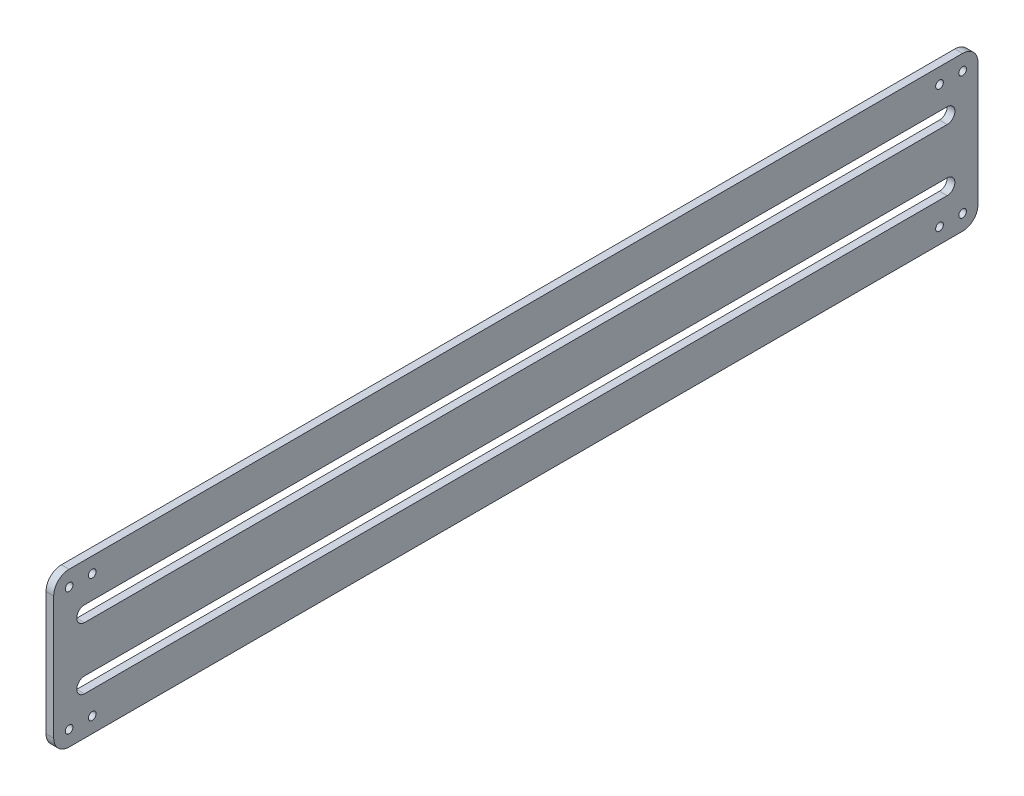
ISO-10303-21;
HEADER;
FILE_DESCRIPTION(('STEP AP214'),'2;1');
FILE_NAME('part.step','',(''),(''),'','','');
FILE_SCHEMA(('AUTOMOTIVE_DESIGN { 1 0 10303 214 1 1 1 1 }'));
ENDSEC;
DATA;
#1=APPLICATION_CONTEXT('core data for automotive mechanical design processes');
#2=APPLICATION_PROTOCOL_DEFINITION('international standard','automotive_design',2000,#1);
#3=PRODUCT_CONTEXT('',#1,'mechanical');
#4=PRODUCT('Part','Part','',(#3));
#5=PRODUCT_RELATED_PRODUCT_CATEGORY('part','',(#4));
#6=PRODUCT_DEFINITION_FORMATION('','',#4);
#7=PRODUCT_DEFINITION_CONTEXT('part definition',#1,'design');
#8=PRODUCT_DEFINITION('design','',#6,#7);
#9=PRODUCT_DEFINITION_SHAPE('','',#8);
#10=(LENGTH_UNIT() NAMED_UNIT(*) SI_UNIT(.MILLI.,.METRE.));
#11=(NAMED_UNIT(*) PLANE_ANGLE_UNIT() SI_UNIT($,.RADIAN.));
#12=(NAMED_UNIT(*) SI_UNIT($,.STERADIAN.) SOLID_ANGLE_UNIT());
#13=UNCERTAINTY_MEASURE_WITH_UNIT(LENGTH_MEASURE(1.E-05),#10,'distance_accuracy_value','');
#14=(GEOMETRIC_REPRESENTATION_CONTEXT(3) GLOBAL_UNCERTAINTY_ASSIGNED_CONTEXT((#13)) GLOBAL_UNIT_ASSIGNED_CONTEXT((#10,
#11,#12)) REPRESENTATION_CONTEXT('',''));
#15=CARTESIAN_POINT('',(0.,0.,0.));
#16=DIRECTION('',(0.,0.,1.));
#17=DIRECTION('',(1.,0.,0.));
#18=AXIS2_PLACEMENT_3D('',#15,#16,#17);
#19=CARTESIAN_POINT('',(1.5875,25.4,-184.15));
#20=DIRECTION('',(-1.,0.,0.));
#21=DIRECTION('',(0.,0.,1.));
#22=AXIS2_PLACEMENT_3D('',#19,#20,#21);
#23=CYLINDRICAL_SURFACE('',#22,6.34999999999999);
#24=CARTESIAN_POINT('',(-1.5875,25.4,-184.15));
#25=DIRECTION('',(1.,0.,0.));
#26=DIRECTION('',(0.,0.,1.));
#27=AXIS2_PLACEMENT_3D('',#24,#25,#26);
#28=CIRCLE('',#27,6.34999999999999);
#29=CARTESIAN_POINT('',(-1.5875,25.4,-190.5));
#30=VERTEX_POINT('',#29);
#31=CARTESIAN_POINT('',(-1.5875,31.75,-184.15));
#32=VERTEX_POINT('',#31);
#33=EDGE_CURVE('E207',#30,#32,#28,.T.);
#34=ORIENTED_EDGE('',*,*,#33,.T.);
#35=DIRECTION('',(-1.,0.,0.));
#36=VECTOR('',#35,1.);
#37=CARTESIAN_POINT('',(1.5875,31.75,-184.15));
#38=LINE('',#37,#36);
#39=CARTESIAN_POINT('',(1.5875,31.75,-184.15));
#40=VERTEX_POINT('',#39);
#41=EDGE_CURVE('E11',#40,#32,#38,.T.);
#42=ORIENTED_EDGE('',*,*,#41,.F.);
#43=CARTESIAN_POINT('',(1.5875,25.4,-184.15));
#44=DIRECTION('',(1.,0.,0.));
#45=DIRECTION('',(0.,0.,1.));
#46=AXIS2_PLACEMENT_3D('',#43,#44,#45);
#47=CIRCLE('',#46,6.34999999999999);
#48=CARTESIAN_POINT('',(1.5875,25.4,-190.5));
#49=VERTEX_POINT('',#48);
#50=EDGE_CURVE('E256',#49,#40,#47,.T.);
#51=ORIENTED_EDGE('',*,*,#50,.F.);
#52=DIRECTION('',(-1.,0.,0.));
#53=VECTOR('',#52,1.);
#54=CARTESIAN_POINT('',(1.5875,25.4,-190.5));
#55=LINE('',#54,#53);
#56=EDGE_CURVE('E282',#49,#30,#55,.T.);
#57=ORIENTED_EDGE('',*,*,#56,.T.);
#58=EDGE_LOOP('',(#34,#42,#51,#57));
#59=FACE_BOUND('',#58,.T.);
#60=ADVANCED_FACE('F45',(#59),#23,.T.);
#61=CARTESIAN_POINT('',(1.5875,31.75,184.15));
#62=DIRECTION('',(0.,-1.,0.));
#63=DIRECTION('',(0.,0.,-1.));
#64=AXIS2_PLACEMENT_3D('',#61,#62,#63);
#65=PLANE('',#64);
#66=DIRECTION('',(0.,0.,1.));
#67=VECTOR('',#66,1.);
#68=CARTESIAN_POINT('',(-1.5875,31.75,184.15));
#69=LINE('',#68,#67);
#70=CARTESIAN_POINT('',(-1.5875,31.75,184.15));
#71=VERTEX_POINT('',#70);
#72=EDGE_CURVE('E286',#32,#71,#69,.T.);
#73=ORIENTED_EDGE('',*,*,#72,.T.);
#74=DIRECTION('',(-1.,0.,0.));
#75=VECTOR('',#74,1.);
#76=CARTESIAN_POINT('',(1.5875,31.75,184.15));
#77=LINE('',#76,#75);
#78=CARTESIAN_POINT('',(1.5875,31.75,184.15));
#79=VERTEX_POINT('',#78);
#80=EDGE_CURVE('E53',#79,#71,#77,.T.);
#81=ORIENTED_EDGE('',*,*,#80,.F.);
#82=DIRECTION('',(0.,0.,1.));
#83=VECTOR('',#82,1.);
#84=CARTESIAN_POINT('',(1.5875,31.75,184.15));
#85=LINE('',#84,#83);
#86=EDGE_CURVE('E260',#40,#79,#85,.T.);
#87=ORIENTED_EDGE('',*,*,#86,.F.);
#88=ORIENTED_EDGE('',*,*,#41,.T.);
#89=EDGE_LOOP('',(#73,#81,#87,#88));
#90=FACE_BOUND('',#89,.T.);
#91=ADVANCED_FACE('F356',(#90),#65,.F.);
#92=CARTESIAN_POINT('',(1.5875,25.4,184.15));
#93=DIRECTION('',(-1.,0.,0.));
#94=DIRECTION('',(0.,0.,1.));
#95=AXIS2_PLACEMENT_3D('',#92,#93,#94);
#96=CYLINDRICAL_SURFACE('',#95,6.34999999999999);
#97=CARTESIAN_POINT('',(-1.5875,25.4,184.15));
#98=DIRECTION('',(1.,0.,0.));
#99=DIRECTION('',(0.,0.,1.));
#100=AXIS2_PLACEMENT_3D('',#97,#98,#99);
#101=CIRCLE('',#100,6.34999999999999);
#102=CARTESIAN_POINT('',(-1.5875,25.4,190.5));
#103=VERTEX_POINT('',#102);
#104=EDGE_CURVE('E289',#71,#103,#101,.T.);
#105=ORIENTED_EDGE('',*,*,#104,.T.);
#106=DIRECTION('',(-1.,0.,0.));
#107=VECTOR('',#106,1.);
#108=CARTESIAN_POINT('',(1.5875,25.4,190.5));
#109=LINE('',#108,#107);
#110=CARTESIAN_POINT('',(1.5875,25.4,190.5));
#111=VERTEX_POINT('',#110);
#112=EDGE_CURVE('E325',#111,#103,#109,.T.);
#113=ORIENTED_EDGE('',*,*,#112,.F.);
#114=CARTESIAN_POINT('',(1.5875,25.4,184.15));
#115=DIRECTION('',(1.,0.,0.));
#116=DIRECTION('',(0.,0.,1.));
#117=AXIS2_PLACEMENT_3D('',#114,#115,#116);
#118=CIRCLE('',#117,6.34999999999999);
#119=EDGE_CURVE('E264',#79,#111,#118,.T.);
#120=ORIENTED_EDGE('',*,*,#119,.F.);
#121=ORIENTED_EDGE('',*,*,#80,.T.);
#122=EDGE_LOOP('',(#105,#113,#120,#121));
#123=FACE_BOUND('',#122,.T.);
#124=ADVANCED_FACE('F334',(#123),#96,.T.);
#125=CARTESIAN_POINT('',(1.5875,-25.4,190.5));
#126=DIRECTION('',(0.,0.,-1.));
#127=DIRECTION('',(-1.,0.,0.));
#128=AXIS2_PLACEMENT_3D('',#125,#126,#127);
#129=PLANE('',#128);
#130=DIRECTION('',(0.,-1.,0.));
#131=VECTOR('',#130,1.);
#132=CARTESIAN_POINT('',(-1.5875,-25.4,190.5));
#133=LINE('',#132,#131);
#134=CARTESIAN_POINT('',(-1.5875,-25.4,190.5));
#135=VERTEX_POINT('',#134);
#136=EDGE_CURVE('E292',#103,#135,#133,.T.);
#137=ORIENTED_EDGE('',*,*,#136,.T.);
#138=DIRECTION('',(-1.,0.,0.));
#139=VECTOR('',#138,1.);
#140=CARTESIAN_POINT('',(1.5875,-25.4,190.5));
#141=LINE('',#140,#139);
#142=CARTESIAN_POINT('',(1.5875,-25.4,190.5));
#143=VERTEX_POINT('',#142);
#144=EDGE_CURVE('E321',#143,#135,#141,.T.);
#145=ORIENTED_EDGE('',*,*,#144,.F.);
#146=DIRECTION('',(0.,-1.,0.));
#147=VECTOR('',#146,1.);
#148=CARTESIAN_POINT('',(1.5875,-25.4,190.5));
#149=LINE('',#148,#147);
#150=EDGE_CURVE('E267',#111,#143,#149,.T.);
#151=ORIENTED_EDGE('',*,*,#150,.F.);
#152=ORIENTED_EDGE('',*,*,#112,.T.);
#153=EDGE_LOOP('',(#137,#145,#151,#152));
#154=FACE_BOUND('',#153,.T.);
#155=ADVANCED_FACE('F344',(#154),#129,.F.);
#156=CARTESIAN_POINT('',(1.5875,-25.4,184.15));
#157=DIRECTION('',(-1.,0.,0.));
#158=DIRECTION('',(0.,0.,1.));
#159=AXIS2_PLACEMENT_3D('',#156,#157,#158);
#160=CYLINDRICAL_SURFACE('',#159,6.34999999999999);
#161=CARTESIAN_POINT('',(-1.5875,-25.4,184.15));
#162=DIRECTION('',(1.,0.,0.));
#163=DIRECTION('',(0.,0.,1.));
#164=AXIS2_PLACEMENT_3D('',#161,#162,#163);
#165=CIRCLE('',#164,6.34999999999999);
#166=CARTESIAN_POINT('',(-1.5875,-31.75,184.15));
#167=VERTEX_POINT('',#166);
#168=EDGE_CURVE('E295',#135,#167,#165,.T.);
#169=ORIENTED_EDGE('',*,*,#168,.T.);
#170=DIRECTION('',(-1.,0.,0.));
#171=VECTOR('',#170,1.);
#172=CARTESIAN_POINT('',(1.5875,-31.75,184.15));
#173=LINE('',#172,#171);
#174=CARTESIAN_POINT('',(1.5875,-31.75,184.15));
#175=VERTEX_POINT('',#174);
#176=EDGE_CURVE('E317',#175,#167,#173,.T.);
#177=ORIENTED_EDGE('',*,*,#176,.F.);
#178=CARTESIAN_POINT('',(1.5875,-25.4,184.15));
#179=DIRECTION('',(1.,0.,0.));
#180=DIRECTION('',(0.,0.,1.));
#181=AXIS2_PLACEMENT_3D('',#178,#179,#180);
#182=CIRCLE('',#181,6.34999999999999);
#183=EDGE_CURVE('E270',#143,#175,#182,.T.);
#184=ORIENTED_EDGE('',*,*,#183,.F.);
#185=ORIENTED_EDGE('',*,*,#144,.T.);
#186=EDGE_LOOP('',(#169,#177,#184,#185));
#187=FACE_BOUND('',#186,.T.);
#188=ADVANCED_FACE('F348',(#187),#160,.T.);
#189=CARTESIAN_POINT('',(1.5875,-31.75,184.15));
#190=DIRECTION('',(0.,1.,0.));
#191=DIRECTION('',(0.,0.,1.));
#192=AXIS2_PLACEMENT_3D('',#189,#190,#191);
#193=PLANE('',#192);
#194=DIRECTION('',(0.,0.,-1.));
#195=VECTOR('',#194,1.);
#196=CARTESIAN_POINT('',(-1.5875,-31.75,184.15));
#197=LINE('',#196,#195);
#198=CARTESIAN_POINT('',(-1.5875,-31.75,-184.15));
#199=VERTEX_POINT('',#198);
#200=EDGE_CURVE('E298',#167,#199,#197,.T.);
#201=ORIENTED_EDGE('',*,*,#200,.T.);
#202=DIRECTION('',(-1.,0.,0.));
#203=VECTOR('',#202,1.);
#204=CARTESIAN_POINT('',(1.5875,-31.75,-184.15));
#205=LINE('',#204,#203);
#206=CARTESIAN_POINT('',(1.5875,-31.75,-184.15));
#207=VERTEX_POINT('',#206);
#208=EDGE_CURVE('E313',#207,#199,#205,.T.);
#209=ORIENTED_EDGE('',*,*,#208,.F.);
#210=DIRECTION('',(0.,0.,-1.));
#211=VECTOR('',#210,1.);
#212=CARTESIAN_POINT('',(1.5875,-31.75,184.15));
#213=LINE('',#212,#211);
#214=EDGE_CURVE('E273',#175,#207,#213,.T.);
#215=ORIENTED_EDGE('',*,*,#214,.F.);
#216=ORIENTED_EDGE('',*,*,#176,.T.);
#217=EDGE_LOOP('',(#201,#209,#215,#216));
#218=FACE_BOUND('',#217,.T.);
#219=ADVANCED_FACE('F369',(#218),#193,.F.);
#220=CARTESIAN_POINT('',(1.5875,-25.4,-184.15));
#221=DIRECTION('',(-1.,0.,0.));
#222=DIRECTION('',(0.,0.,1.));
#223=AXIS2_PLACEMENT_3D('',#220,#221,#222);
#224=CYLINDRICAL_SURFACE('',#223,6.34999999999999);
#225=CARTESIAN_POINT('',(-1.5875,-25.4,-184.15));
#226=DIRECTION('',(1.,0.,0.));
#227=DIRECTION('',(0.,0.,1.));
#228=AXIS2_PLACEMENT_3D('',#225,#226,#227);
#229=CIRCLE('',#228,6.34999999999999);
#230=CARTESIAN_POINT('',(-1.5875,-25.4,-190.5));
#231=VERTEX_POINT('',#230);
#232=EDGE_CURVE('E301',#199,#231,#229,.T.);
#233=ORIENTED_EDGE('',*,*,#232,.T.);
#234=DIRECTION('',(-1.,0.,0.));
#235=VECTOR('',#234,1.);
#236=CARTESIAN_POINT('',(1.5875,-25.4,-190.5));
#237=LINE('',#236,#235);
#238=CARTESIAN_POINT('',(1.5875,-25.4,-190.5));
#239=VERTEX_POINT('',#238);
#240=EDGE_CURVE('E309',#239,#231,#237,.T.);
#241=ORIENTED_EDGE('',*,*,#240,.F.);
#242=CARTESIAN_POINT('',(1.5875,-25.4,-184.15));
#243=DIRECTION('',(1.,0.,0.));
#244=DIRECTION('',(0.,0.,1.));
#245=AXIS2_PLACEMENT_3D('',#242,#243,#244);
#246=CIRCLE('',#245,6.34999999999999);
#247=EDGE_CURVE('E276',#207,#239,#246,.T.);
#248=ORIENTED_EDGE('',*,*,#247,.F.);
#249=ORIENTED_EDGE('',*,*,#208,.T.);
#250=EDGE_LOOP('',(#233,#241,#248,#249));
#251=FACE_BOUND('',#250,.T.);
#252=ADVANCED_FACE('F367',(#251),#224,.T.);
#253=CARTESIAN_POINT('',(1.5875,-25.4,-190.5));
#254=DIRECTION('',(0.,0.,1.));
#255=DIRECTION('',(1.,0.,0.));
#256=AXIS2_PLACEMENT_3D('',#253,#254,#255);
#257=PLANE('',#256);
#258=DIRECTION('',(0.,1.,0.));
#259=VECTOR('',#258,1.);
#260=CARTESIAN_POINT('',(-1.5875,-25.4,-190.5));
#261=LINE('',#260,#259);
#262=EDGE_CURVE('E261',#231,#30,#261,.T.);
#263=ORIENTED_EDGE('',*,*,#262,.T.);
#264=ORIENTED_EDGE('',*,*,#56,.F.);
#265=DIRECTION('',(0.,1.,0.));
#266=VECTOR('',#265,1.);
#267=CARTESIAN_POINT('',(1.5875,-25.4,-190.5));
#268=LINE('',#267,#266);
#269=EDGE_CURVE('E279',#239,#49,#268,.T.);
#270=ORIENTED_EDGE('',*,*,#269,.F.);
#271=ORIENTED_EDGE('',*,*,#240,.T.);
#272=EDGE_LOOP('',(#263,#264,#270,#271));
#273=FACE_BOUND('',#272,.T.);
#274=ADVANCED_FACE('F362',(#273),#257,.F.);
#275=CARTESIAN_POINT('',(1.5875,25.4,-184.15));
#276=DIRECTION('',(-1.,0.,0.));
#277=DIRECTION('',(0.,0.,1.));
#278=AXIS2_PLACEMENT_3D('',#275,#276,#277);
#279=PLANE('',#278);
#280=CARTESIAN_POINT('',(1.5875,25.3999999999994,-174.625));
#281=DIRECTION('',(1.,0.,0.));
#282=DIRECTION('',(0.,0.,1.));
#283=AXIS2_PLACEMENT_3D('',#280,#281,#282);
#284=CIRCLE('',#283,1.58749999999999);
#285=CARTESIAN_POINT('',(1.5875,25.3999999999994,-173.0375));
#286=VERTEX_POINT('',#285);
#287=EDGE_CURVE('E598',#286,#286,#284,.T.);
#288=ORIENTED_EDGE('',*,*,#287,.F.);
#289=EDGE_LOOP('',(#288));
#290=FACE_BOUND('',#289,.T.);
#291=CARTESIAN_POINT('',(1.5875,-25.4,184.15));
#292=DIRECTION('',(1.,0.,0.));
#293=DIRECTION('',(0.,0.,1.));
#294=AXIS2_PLACEMENT_3D('',#291,#292,#293);
#295=CIRCLE('',#294,1.58749999999999);
#296=CARTESIAN_POINT('',(1.5875,-25.4,185.7375));
#297=VERTEX_POINT('',#296);
#298=EDGE_CURVE('E605',#297,#297,#295,.T.);
#299=ORIENTED_EDGE('',*,*,#298,.F.);
#300=EDGE_LOOP('',(#299));
#301=FACE_BOUND('',#300,.T.);
#302=CARTESIAN_POINT('',(1.5875,-25.4,174.625));
#303=DIRECTION('',(1.,0.,0.));
#304=DIRECTION('',(0.,0.,1.));
#305=AXIS2_PLACEMENT_3D('',#302,#303,#304);
#306=CIRCLE('',#305,1.58749999999999);
#307=CARTESIAN_POINT('',(1.5875,-25.4,176.2125));
#308=VERTEX_POINT('',#307);
#309=EDGE_CURVE('E619',#308,#308,#306,.T.);
#310=ORIENTED_EDGE('',*,*,#309,.F.);
#311=EDGE_LOOP('',(#310));
#312=FACE_BOUND('',#311,.T.);
#313=CARTESIAN_POINT('',(1.5875,25.4,174.625));
#314=DIRECTION('',(1.,0.,0.));
#315=DIRECTION('',(0.,0.,-1.));
#316=AXIS2_PLACEMENT_3D('',#313,#314,#315);
#317=CIRCLE('',#316,1.58749999999999);
#318=CARTESIAN_POINT('',(1.5875,25.4,173.0375));
#319=VERTEX_POINT('',#318);
#320=EDGE_CURVE('E611',#319,#319,#317,.T.);
#321=ORIENTED_EDGE('',*,*,#320,.F.);
#322=EDGE_LOOP('',(#321));
#323=FACE_BOUND('',#322,.T.);
#324=CARTESIAN_POINT('',(1.5875,25.3999999999994,-184.15));
#325=DIRECTION('',(1.,0.,0.));
#326=DIRECTION('',(0.,0.,1.));
#327=AXIS2_PLACEMENT_3D('',#324,#325,#326);
#328=CIRCLE('',#327,1.58749999999999);
#329=CARTESIAN_POINT('',(1.5875,25.3999999999994,-182.5625));
#330=VERTEX_POINT('',#329);
#331=EDGE_CURVE('E607',#330,#330,#328,.T.);
#332=ORIENTED_EDGE('',*,*,#331,.F.);
#333=EDGE_LOOP('',(#332));
#334=FACE_BOUND('',#333,.T.);
#335=CARTESIAN_POINT('',(1.5875,-25.4000000000006,-184.15));
#336=DIRECTION('',(1.,0.,0.));
#337=DIRECTION('',(0.,0.,-1.));
#338=AXIS2_PLACEMENT_3D('',#335,#336,#337);
#339=CIRCLE('',#338,1.58749999999998);
#340=CARTESIAN_POINT('',(1.5875,-25.4000000000006,-185.7375));
#341=VERTEX_POINT('',#340);
#342=EDGE_CURVE('E663',#341,#341,#339,.T.);
#343=ORIENTED_EDGE('',*,*,#342,.F.);
#344=EDGE_LOOP('',(#343));
#345=FACE_BOUND('',#344,.T.);
#346=CARTESIAN_POINT('',(1.5875,-25.4000000000006,-174.625));
#347=DIRECTION('',(1.,0.,0.));
#348=DIRECTION('',(0.,0.,-1.));
#349=AXIS2_PLACEMENT_3D('',#346,#347,#348);
#350=CIRCLE('',#349,1.58749999999998);
#351=CARTESIAN_POINT('',(1.5875,-25.4000000000006,-176.2125));
#352=VERTEX_POINT('',#351);
#353=EDGE_CURVE('E655',#352,#352,#350,.T.);
#354=ORIENTED_EDGE('',*,*,#353,.F.);
#355=EDGE_LOOP('',(#354));
#356=FACE_BOUND('',#355,.T.);
#357=CARTESIAN_POINT('',(1.5875,25.4,184.15));
#358=DIRECTION('',(1.,0.,0.));
#359=DIRECTION('',(0.,0.,-1.));
#360=AXIS2_PLACEMENT_3D('',#357,#358,#359);
#361=CIRCLE('',#360,1.58749999999999);
#362=CARTESIAN_POINT('',(1.5875,25.4,182.5625));
#363=VERTEX_POINT('',#362);
#364=EDGE_CURVE('E189',#363,#363,#361,.T.);
#365=ORIENTED_EDGE('',*,*,#364,.F.);
#366=EDGE_LOOP('',(#365));
#367=FACE_BOUND('',#366,.T.);
#368=DIRECTION('',(0.,0.,-1.));
#369=VECTOR('',#368,1.);
#370=CARTESIAN_POINT('',(1.5875,9.52500000000001,177.8));
#371=LINE('',#370,#369);
#372=CARTESIAN_POINT('',(1.5875,9.52500000000001,177.8));
#373=VERTEX_POINT('',#372);
#374=CARTESIAN_POINT('',(1.5875,9.52500000000001,-177.8));
#375=VERTEX_POINT('',#374);
#376=EDGE_CURVE('E198',#373,#375,#371,.T.);
#377=ORIENTED_EDGE('',*,*,#376,.F.);
#378=CARTESIAN_POINT('',(1.5875,12.7,177.8));
#379=DIRECTION('',(1.,0.,0.));
#380=DIRECTION('',(0.,0.,-1.));
#381=AXIS2_PLACEMENT_3D('',#378,#379,#380);
#382=CIRCLE('',#381,3.17499999999999);
#383=CARTESIAN_POINT('',(1.5875,15.875,177.8));
#384=VERTEX_POINT('',#383);
#385=EDGE_CURVE('E60',#384,#373,#382,.T.);
#386=ORIENTED_EDGE('',*,*,#385,.F.);
#387=DIRECTION('',(0.,0.,1.));
#388=VECTOR('',#387,1.);
#389=CARTESIAN_POINT('',(1.5875,15.875,177.8));
#390=LINE('',#389,#388);
#391=CARTESIAN_POINT('',(1.5875,15.875,-177.8));
#392=VERTEX_POINT('',#391);
#393=EDGE_CURVE('E182',#392,#384,#390,.T.);
#394=ORIENTED_EDGE('',*,*,#393,.F.);
#395=CARTESIAN_POINT('',(1.5875,12.7,-177.8));
#396=DIRECTION('',(1.,0.,0.));
#397=DIRECTION('',(0.,0.,-1.));
#398=AXIS2_PLACEMENT_3D('',#395,#396,#397);
#399=CIRCLE('',#398,3.17499999999999);
#400=EDGE_CURVE('E186',#375,#392,#399,.T.);
#401=ORIENTED_EDGE('',*,*,#400,.F.);
#402=EDGE_LOOP('',(#377,#386,#394,#401));
#403=FACE_BOUND('',#402,.T.);
#404=DIRECTION('',(0.,0.,-1.));
#405=VECTOR('',#404,1.);
#406=CARTESIAN_POINT('',(1.5875,-15.875,177.8));
#407=LINE('',#406,#405);
#408=CARTESIAN_POINT('',(1.5875,-15.875,177.8));
#409=VERTEX_POINT('',#408);
#410=CARTESIAN_POINT('',(1.5875,-15.875,-177.8));
#411=VERTEX_POINT('',#410);
#412=EDGE_CURVE('E236',#409,#411,#407,.T.);
#413=ORIENTED_EDGE('',*,*,#412,.F.);
#414=CARTESIAN_POINT('',(1.5875,-12.7,177.8));
#415=DIRECTION('',(1.,0.,0.));
#416=DIRECTION('',(0.,0.,1.));
#417=AXIS2_PLACEMENT_3D('',#414,#415,#416);
#418=CIRCLE('',#417,3.17499999999999);
#419=CARTESIAN_POINT('',(1.5875,-9.52500000000001,177.8));
#420=VERTEX_POINT('',#419);
#421=EDGE_CURVE('E68',#420,#409,#418,.T.);
#422=ORIENTED_EDGE('',*,*,#421,.F.);
#423=DIRECTION('',(0.,0.,1.));
#424=VECTOR('',#423,1.);
#425=CARTESIAN_POINT('',(1.5875,-9.52500000000001,177.8));
#426=LINE('',#425,#424);
#427=CARTESIAN_POINT('',(1.5875,-9.52500000000001,-177.8));
#428=VERTEX_POINT('',#427);
#429=EDGE_CURVE('E227',#428,#420,#426,.T.);
#430=ORIENTED_EDGE('',*,*,#429,.F.);
#431=CARTESIAN_POINT('',(1.5875,-12.7,-177.8));
#432=DIRECTION('',(1.,0.,0.));
#433=DIRECTION('',(0.,0.,1.));
#434=AXIS2_PLACEMENT_3D('',#431,#432,#433);
#435=CIRCLE('',#434,3.17499999999999);
#436=EDGE_CURVE('E231',#411,#428,#435,.T.);
#437=ORIENTED_EDGE('',*,*,#436,.F.);
#438=EDGE_LOOP('',(#413,#422,#430,#437));
#439=FACE_BOUND('',#438,.T.);
#440=ORIENTED_EDGE('',*,*,#50,.T.);
#441=ORIENTED_EDGE('',*,*,#86,.T.);
#442=ORIENTED_EDGE('',*,*,#119,.T.);
#443=ORIENTED_EDGE('',*,*,#150,.T.);
#444=ORIENTED_EDGE('',*,*,#183,.T.);
#445=ORIENTED_EDGE('',*,*,#214,.T.);
#446=ORIENTED_EDGE('',*,*,#247,.T.);
#447=ORIENTED_EDGE('',*,*,#269,.T.);
#448=EDGE_LOOP('',(#440,#441,#442,#443,#444,#445,#446,#447));
#449=FACE_BOUND('',#448,.T.);
#450=ADVANCED_FACE('F352',(#290,#301,#312,#323,#334,#345,#356,#367,#403,#439,#449),#279,.F.);
#451=CARTESIAN_POINT('',(-1.5875,25.4,-184.15));
#452=DIRECTION('',(-1.,0.,0.));
#453=DIRECTION('',(0.,0.,1.));
#454=AXIS2_PLACEMENT_3D('',#451,#452,#453);
#455=PLANE('',#454);
#456=CARTESIAN_POINT('',(-1.5875,25.3999999999994,-174.625));
#457=DIRECTION('',(1.,0.,0.));
#458=DIRECTION('',(0.,0.,1.));
#459=AXIS2_PLACEMENT_3D('',#456,#457,#458);
#460=CIRCLE('',#459,1.58749999999999);
#461=CARTESIAN_POINT('',(-1.5875,25.3999999999994,-173.0375));
#462=VERTEX_POINT('',#461);
#463=EDGE_CURVE('E595',#462,#462,#460,.T.);
#464=ORIENTED_EDGE('',*,*,#463,.T.);
#465=EDGE_LOOP('',(#464));
#466=FACE_BOUND('',#465,.T.);
#467=CARTESIAN_POINT('',(-1.5875,-25.4,184.15));
#468=DIRECTION('',(1.,0.,0.));
#469=DIRECTION('',(0.,0.,1.));
#470=AXIS2_PLACEMENT_3D('',#467,#468,#469);
#471=CIRCLE('',#470,1.58749999999999);
#472=CARTESIAN_POINT('',(-1.5875,-25.4,185.7375));
#473=VERTEX_POINT('',#472);
#474=EDGE_CURVE('E600',#473,#473,#471,.T.);
#475=ORIENTED_EDGE('',*,*,#474,.T.);
#476=EDGE_LOOP('',(#475));
#477=FACE_BOUND('',#476,.T.);
#478=CARTESIAN_POINT('',(-1.5875,-25.4,174.625));
#479=DIRECTION('',(1.,0.,0.));
#480=DIRECTION('',(0.,0.,1.));
#481=AXIS2_PLACEMENT_3D('',#478,#479,#480);
#482=CIRCLE('',#481,1.58749999999999);
#483=CARTESIAN_POINT('',(-1.5875,-25.4,176.2125));
#484=VERTEX_POINT('',#483);
#485=EDGE_CURVE('E623',#484,#484,#482,.T.);
#486=ORIENTED_EDGE('',*,*,#485,.T.);
#487=EDGE_LOOP('',(#486));
#488=FACE_BOUND('',#487,.T.);
#489=CARTESIAN_POINT('',(-1.5875,25.4,174.625));
#490=DIRECTION('',(1.,0.,0.));
#491=DIRECTION('',(0.,0.,-1.));
#492=AXIS2_PLACEMENT_3D('',#489,#490,#491);
#493=CIRCLE('',#492,1.58749999999999);
#494=CARTESIAN_POINT('',(-1.5875,25.4,173.0375));
#495=VERTEX_POINT('',#494);
#496=EDGE_CURVE('E615',#495,#495,#493,.T.);
#497=ORIENTED_EDGE('',*,*,#496,.T.);
#498=EDGE_LOOP('',(#497));
#499=FACE_BOUND('',#498,.T.);
#500=CARTESIAN_POINT('',(-1.5875,25.3999999999994,-184.15));
#501=DIRECTION('',(1.,0.,0.));
#502=DIRECTION('',(0.,0.,1.));
#503=AXIS2_PLACEMENT_3D('',#500,#501,#502);
#504=CIRCLE('',#503,1.58749999999999);
#505=CARTESIAN_POINT('',(-1.5875,25.3999999999994,-182.5625));
#506=VERTEX_POINT('',#505);
#507=EDGE_CURVE('E667',#506,#506,#504,.T.);
#508=ORIENTED_EDGE('',*,*,#507,.T.);
#509=EDGE_LOOP('',(#508));
#510=FACE_BOUND('',#509,.T.);
#511=CARTESIAN_POINT('',(-1.5875,-25.4000000000006,-184.15));
#512=DIRECTION('',(1.,0.,0.));
#513=DIRECTION('',(0.,0.,-1.));
#514=AXIS2_PLACEMENT_3D('',#511,#512,#513);
#515=CIRCLE('',#514,1.58749999999998);
#516=CARTESIAN_POINT('',(-1.5875,-25.4000000000006,-185.7375));
#517=VERTEX_POINT('',#516);
#518=EDGE_CURVE('E659',#517,#517,#515,.T.);
#519=ORIENTED_EDGE('',*,*,#518,.T.);
#520=EDGE_LOOP('',(#519));
#521=FACE_BOUND('',#520,.T.);
#522=CARTESIAN_POINT('',(-1.5875,-25.4000000000006,-174.625));
#523=DIRECTION('',(1.,0.,0.));
#524=DIRECTION('',(0.,0.,-1.));
#525=AXIS2_PLACEMENT_3D('',#522,#523,#524);
#526=CIRCLE('',#525,1.58749999999998);
#527=CARTESIAN_POINT('',(-1.5875,-25.4000000000006,-176.2125));
#528=VERTEX_POINT('',#527);
#529=EDGE_CURVE('E651',#528,#528,#526,.T.);
#530=ORIENTED_EDGE('',*,*,#529,.T.);
#531=EDGE_LOOP('',(#530));
#532=FACE_BOUND('',#531,.T.);
#533=CARTESIAN_POINT('',(-1.5875,25.4,184.15));
#534=DIRECTION('',(1.,0.,0.));
#535=DIRECTION('',(0.,0.,-1.));
#536=AXIS2_PLACEMENT_3D('',#533,#534,#535);
#537=CIRCLE('',#536,1.58749999999999);
#538=CARTESIAN_POINT('',(-1.5875,25.4,182.5625));
#539=VERTEX_POINT('',#538);
#540=EDGE_CURVE('E226',#539,#539,#537,.T.);
#541=ORIENTED_EDGE('',*,*,#540,.T.);
#542=EDGE_LOOP('',(#541));
#543=FACE_BOUND('',#542,.T.);
#544=CARTESIAN_POINT('',(-1.5875,12.7,177.8));
#545=DIRECTION('',(1.,0.,0.));
#546=DIRECTION('',(0.,0.,-1.));
#547=AXIS2_PLACEMENT_3D('',#544,#545,#546);
#548=CIRCLE('',#547,3.17499999999999);
#549=CARTESIAN_POINT('',(-1.5875,15.875,177.8));
#550=VERTEX_POINT('',#549);
#551=CARTESIAN_POINT('',(-1.5875,9.52500000000001,177.8));
#552=VERTEX_POINT('',#551);
#553=EDGE_CURVE('E160',#550,#552,#548,.T.);
#554=ORIENTED_EDGE('',*,*,#553,.T.);
#555=DIRECTION('',(0.,0.,-1.));
#556=VECTOR('',#555,1.);
#557=CARTESIAN_POINT('',(-1.5875,9.52500000000001,177.8));
#558=LINE('',#557,#556);
#559=CARTESIAN_POINT('',(-1.5875,9.52500000000001,-177.8));
#560=VERTEX_POINT('',#559);
#561=EDGE_CURVE('E171',#552,#560,#558,.T.);
#562=ORIENTED_EDGE('',*,*,#561,.T.);
#563=CARTESIAN_POINT('',(-1.5875,12.7,-177.8));
#564=DIRECTION('',(1.,0.,0.));
#565=DIRECTION('',(0.,0.,-1.));
#566=AXIS2_PLACEMENT_3D('',#563,#564,#565);
#567=CIRCLE('',#566,3.17499999999999);
#568=CARTESIAN_POINT('',(-1.5875,15.875,-177.8));
#569=VERTEX_POINT('',#568);
#570=EDGE_CURVE('E176',#560,#569,#567,.T.);
#571=ORIENTED_EDGE('',*,*,#570,.T.);
#572=DIRECTION('',(0.,0.,1.));
#573=VECTOR('',#572,1.);
#574=CARTESIAN_POINT('',(-1.5875,15.875,177.8));
#575=LINE('',#574,#573);
#576=EDGE_CURVE('E167',#569,#550,#575,.T.);
#577=ORIENTED_EDGE('',*,*,#576,.T.);
#578=EDGE_LOOP('',(#554,#562,#571,#577));
#579=FACE_BOUND('',#578,.T.);
#580=CARTESIAN_POINT('',(-1.5875,-12.7,177.8));
#581=DIRECTION('',(1.,0.,0.));
#582=DIRECTION('',(0.,0.,1.));
#583=AXIS2_PLACEMENT_3D('',#580,#581,#582);
#584=CIRCLE('',#583,3.17499999999999);
#585=CARTESIAN_POINT('',(-1.5875,-9.52500000000001,177.8));
#586=VERTEX_POINT('',#585);
#587=CARTESIAN_POINT('',(-1.5875,-15.875,177.8));
#588=VERTEX_POINT('',#587);
#589=EDGE_CURVE('E232',#586,#588,#584,.T.);
#590=ORIENTED_EDGE('',*,*,#589,.T.);
#591=DIRECTION('',(0.,0.,-1.));
#592=VECTOR('',#591,1.);
#593=CARTESIAN_POINT('',(-1.5875,-15.875,177.8));
#594=LINE('',#593,#592);
#595=CARTESIAN_POINT('',(-1.5875,-15.875,-177.8));
#596=VERTEX_POINT('',#595);
#597=EDGE_CURVE('E249',#588,#596,#594,.T.);
#598=ORIENTED_EDGE('',*,*,#597,.T.);
#599=CARTESIAN_POINT('',(-1.5875,-12.7,-177.8));
#600=DIRECTION('',(1.,0.,0.));
#601=DIRECTION('',(0.,0.,1.));
#602=AXIS2_PLACEMENT_3D('',#599,#600,#601);
#603=CIRCLE('',#602,3.17499999999999);
#604=CARTESIAN_POINT('',(-1.5875,-9.52500000000001,-177.8));
#605=VERTEX_POINT('',#604);
#606=EDGE_CURVE('E245',#596,#605,#603,.T.);
#607=ORIENTED_EDGE('',*,*,#606,.T.);
#608=DIRECTION('',(0.,0.,1.));
#609=VECTOR('',#608,1.);
#610=CARTESIAN_POINT('',(-1.5875,-9.52500000000001,177.8));
#611=LINE('',#610,#609);
#612=EDGE_CURVE('E216',#605,#586,#611,.T.);
#613=ORIENTED_EDGE('',*,*,#612,.T.);
#614=EDGE_LOOP('',(#590,#598,#607,#613));
#615=FACE_BOUND('',#614,.T.);
#616=ORIENTED_EDGE('',*,*,#33,.F.);
#617=ORIENTED_EDGE('',*,*,#262,.F.);
#618=ORIENTED_EDGE('',*,*,#232,.F.);
#619=ORIENTED_EDGE('',*,*,#200,.F.);
#620=ORIENTED_EDGE('',*,*,#168,.F.);
#621=ORIENTED_EDGE('',*,*,#136,.F.);
#622=ORIENTED_EDGE('',*,*,#104,.F.);
#623=ORIENTED_EDGE('',*,*,#72,.F.);
#624=EDGE_LOOP('',(#616,#617,#618,#619,#620,#621,#622,#623));
#625=FACE_BOUND('',#624,.T.);
#626=ADVANCED_FACE('F178',(#466,#477,#488,#499,#510,#521,#532,#543,#579,#615,#625),#455,.T.);
#627=CARTESIAN_POINT('',(-1.5875,-12.7,177.8));
#628=DIRECTION('',(1.,0.,0.));
#629=DIRECTION('',(0.,0.,-1.));
#630=AXIS2_PLACEMENT_3D('',#627,#628,#629);
#631=CYLINDRICAL_SURFACE('',#630,3.17499999999999);
#632=ORIENTED_EDGE('',*,*,#421,.T.);
#633=DIRECTION('',(1.,0.,0.));
#634=VECTOR('',#633,1.);
#635=CARTESIAN_POINT('',(-1.5875,-15.875,177.8));
#636=LINE('',#635,#634);
#637=EDGE_CURVE('E213',#588,#409,#636,.T.);
#638=ORIENTED_EDGE('',*,*,#637,.F.);
#639=ORIENTED_EDGE('',*,*,#589,.F.);
#640=DIRECTION('',(1.,0.,0.));
#641=VECTOR('',#640,1.);
#642=CARTESIAN_POINT('',(-1.5875,-9.52500000000001,177.8));
#643=LINE('',#642,#641);
#644=EDGE_CURVE('E223',#586,#420,#643,.T.);
#645=ORIENTED_EDGE('',*,*,#644,.T.);
#646=EDGE_LOOP('',(#632,#638,#639,#645));
#647=FACE_BOUND('',#646,.T.);
#648=ADVANCED_FACE('F436',(#647),#631,.F.);
#649=CARTESIAN_POINT('',(-1.5875,-9.52500000000001,177.8));
#650=DIRECTION('',(0.,1.,0.));
#651=DIRECTION('',(0.,0.,1.));
#652=AXIS2_PLACEMENT_3D('',#649,#650,#651);
#653=PLANE('',#652);
#654=ORIENTED_EDGE('',*,*,#429,.T.);
#655=ORIENTED_EDGE('',*,*,#644,.F.);
#656=ORIENTED_EDGE('',*,*,#612,.F.);
#657=DIRECTION('',(1.,0.,0.));
#658=VECTOR('',#657,1.);
#659=CARTESIAN_POINT('',(-1.5875,-9.52500000000001,-177.8));
#660=LINE('',#659,#658);
#661=EDGE_CURVE('E220',#605,#428,#660,.T.);
#662=ORIENTED_EDGE('',*,*,#661,.T.);
#663=EDGE_LOOP('',(#654,#655,#656,#662));
#664=FACE_BOUND('',#663,.T.);
#665=ADVANCED_FACE('F446',(#664),#653,.F.);
#666=CARTESIAN_POINT('',(-1.5875,-12.7,-177.8));
#667=DIRECTION('',(1.,0.,0.));
#668=DIRECTION('',(0.,0.,-1.));
#669=AXIS2_PLACEMENT_3D('',#666,#667,#668);
#670=CYLINDRICAL_SURFACE('',#669,3.17499999999999);
#671=ORIENTED_EDGE('',*,*,#436,.T.);
#672=ORIENTED_EDGE('',*,*,#661,.F.);
#673=ORIENTED_EDGE('',*,*,#606,.F.);
#674=DIRECTION('',(1.,0.,0.));
#675=VECTOR('',#674,1.);
#676=CARTESIAN_POINT('',(-1.5875,-15.875,-177.8));
#677=LINE('',#676,#675);
#678=EDGE_CURVE('E217',#596,#411,#677,.T.);
#679=ORIENTED_EDGE('',*,*,#678,.T.);
#680=EDGE_LOOP('',(#671,#672,#673,#679));
#681=FACE_BOUND('',#680,.T.);
#682=ADVANCED_FACE('F455',(#681),#670,.F.);
#683=CARTESIAN_POINT('',(-1.5875,-15.875,177.8));
#684=DIRECTION('',(0.,-1.,0.));
#685=DIRECTION('',(0.,0.,-1.));
#686=AXIS2_PLACEMENT_3D('',#683,#684,#685);
#687=PLANE('',#686);
#688=ORIENTED_EDGE('',*,*,#412,.T.);
#689=ORIENTED_EDGE('',*,*,#678,.F.);
#690=ORIENTED_EDGE('',*,*,#597,.F.);
#691=ORIENTED_EDGE('',*,*,#637,.T.);
#692=EDGE_LOOP('',(#688,#689,#690,#691));
#693=FACE_BOUND('',#692,.T.);
#694=ADVANCED_FACE('F465',(#693),#687,.F.);
#695=CARTESIAN_POINT('',(-1.5875,12.7,177.8));
#696=DIRECTION('',(1.,0.,0.));
#697=DIRECTION('',(0.,0.,-1.));
#698=AXIS2_PLACEMENT_3D('',#695,#696,#697);
#699=CYLINDRICAL_SURFACE('',#698,3.17499999999999);
#700=ORIENTED_EDGE('',*,*,#385,.T.);
#701=DIRECTION('',(1.,0.,0.));
#702=VECTOR('',#701,1.);
#703=CARTESIAN_POINT('',(-1.5875,9.52500000000001,177.8));
#704=LINE('',#703,#702);
#705=EDGE_CURVE('E156',#552,#373,#704,.T.);
#706=ORIENTED_EDGE('',*,*,#705,.F.);
#707=ORIENTED_EDGE('',*,*,#553,.F.);
#708=DIRECTION('',(1.,0.,0.));
#709=VECTOR('',#708,1.);
#710=CARTESIAN_POINT('',(-1.5875,15.875,177.8));
#711=LINE('',#710,#709);
#712=EDGE_CURVE('E204',#550,#384,#711,.T.);
#713=ORIENTED_EDGE('',*,*,#712,.T.);
#714=EDGE_LOOP('',(#700,#706,#707,#713));
#715=FACE_BOUND('',#714,.T.);
#716=ADVANCED_FACE('F158',(#715),#699,.F.);
#717=CARTESIAN_POINT('',(-1.5875,15.875,177.8));
#718=DIRECTION('',(0.,1.,0.));
#719=DIRECTION('',(0.,0.,1.));
#720=AXIS2_PLACEMENT_3D('',#717,#718,#719);
#721=PLANE('',#720);
#722=ORIENTED_EDGE('',*,*,#393,.T.);
#723=ORIENTED_EDGE('',*,*,#712,.F.);
#724=ORIENTED_EDGE('',*,*,#576,.F.);
#725=DIRECTION('',(1.,0.,0.));
#726=VECTOR('',#725,1.);
#727=CARTESIAN_POINT('',(-1.5875,15.875,-177.8));
#728=LINE('',#727,#726);
#729=EDGE_CURVE('E208',#569,#392,#728,.T.);
#730=ORIENTED_EDGE('',*,*,#729,.T.);
#731=EDGE_LOOP('',(#722,#723,#724,#730));
#732=FACE_BOUND('',#731,.T.);
#733=ADVANCED_FACE('F484',(#732),#721,.F.);
#734=CARTESIAN_POINT('',(-1.5875,12.7,-177.8));
#735=DIRECTION('',(1.,0.,0.));
#736=DIRECTION('',(0.,0.,-1.));
#737=AXIS2_PLACEMENT_3D('',#734,#735,#736);
#738=CYLINDRICAL_SURFACE('',#737,3.17499999999999);
#739=ORIENTED_EDGE('',*,*,#400,.T.);
#740=ORIENTED_EDGE('',*,*,#729,.F.);
#741=ORIENTED_EDGE('',*,*,#570,.F.);
#742=DIRECTION('',(1.,0.,0.));
#743=VECTOR('',#742,1.);
#744=CARTESIAN_POINT('',(-1.5875,9.52500000000001,-177.8));
#745=LINE('',#744,#743);
#746=EDGE_CURVE('E166',#560,#375,#745,.T.);
#747=ORIENTED_EDGE('',*,*,#746,.T.);
#748=EDGE_LOOP('',(#739,#740,#741,#747));
#749=FACE_BOUND('',#748,.T.);
#750=ADVANCED_FACE('F493',(#749),#738,.F.);
#751=CARTESIAN_POINT('',(-1.5875,9.52500000000001,177.8));
#752=DIRECTION('',(0.,-1.,0.));
#753=DIRECTION('',(0.,0.,-1.));
#754=AXIS2_PLACEMENT_3D('',#751,#752,#753);
#755=PLANE('',#754);
#756=ORIENTED_EDGE('',*,*,#376,.T.);
#757=ORIENTED_EDGE('',*,*,#746,.F.);
#758=ORIENTED_EDGE('',*,*,#561,.F.);
#759=ORIENTED_EDGE('',*,*,#705,.T.);
#760=EDGE_LOOP('',(#756,#757,#758,#759));
#761=FACE_BOUND('',#760,.T.);
#762=ADVANCED_FACE('F172',(#761),#755,.F.);
#763=CARTESIAN_POINT('',(-1.5875,25.4,184.15));
#764=DIRECTION('',(1.,0.,0.));
#765=DIRECTION('',(0.,0.,-1.));
#766=AXIS2_PLACEMENT_3D('',#763,#764,#765);
#767=CYLINDRICAL_SURFACE('',#766,1.58749999999999);
#768=ORIENTED_EDGE('',*,*,#540,.F.);
#769=EDGE_LOOP('',(#768));
#770=FACE_BOUND('',#769,.T.);
#771=ORIENTED_EDGE('',*,*,#364,.T.);
#772=EDGE_LOOP('',(#771));
#773=FACE_BOUND('',#772,.T.);
#774=ADVANCED_FACE('F511',(#770,#773),#767,.F.);
#775=CARTESIAN_POINT('',(-1.5875,-25.4000000000006,-174.625));
#776=DIRECTION('',(1.,0.,0.));
#777=DIRECTION('',(0.,0.,-1.));
#778=AXIS2_PLACEMENT_3D('',#775,#776,#777);
#779=CYLINDRICAL_SURFACE('',#778,1.58749999999998);
#780=ORIENTED_EDGE('',*,*,#529,.F.);
#781=EDGE_LOOP('',(#780));
#782=FACE_BOUND('',#781,.T.);
#783=ORIENTED_EDGE('',*,*,#353,.T.);
#784=EDGE_LOOP('',(#783));
#785=FACE_BOUND('',#784,.T.);
#786=ADVANCED_FACE('F519',(#782,#785),#779,.F.);
#787=CARTESIAN_POINT('',(-1.5875,-25.4000000000006,-184.15));
#788=DIRECTION('',(1.,0.,0.));
#789=DIRECTION('',(0.,0.,-1.));
#790=AXIS2_PLACEMENT_3D('',#787,#788,#789);
#791=CYLINDRICAL_SURFACE('',#790,1.58749999999998);
#792=ORIENTED_EDGE('',*,*,#518,.F.);
#793=EDGE_LOOP('',(#792));
#794=FACE_BOUND('',#793,.T.);
#795=ORIENTED_EDGE('',*,*,#342,.T.);
#796=EDGE_LOOP('',(#795));
#797=FACE_BOUND('',#796,.T.);
#798=ADVANCED_FACE('F529',(#794,#797),#791,.F.);
#799=CARTESIAN_POINT('',(-1.5875,25.3999999999994,-184.15));
#800=DIRECTION('',(1.,0.,0.));
#801=DIRECTION('',(0.,0.,-1.));
#802=AXIS2_PLACEMENT_3D('',#799,#800,#801);
#803=CYLINDRICAL_SURFACE('',#802,1.58749999999999);
#804=ORIENTED_EDGE('',*,*,#507,.F.);
#805=EDGE_LOOP('',(#804));
#806=FACE_BOUND('',#805,.T.);
#807=ORIENTED_EDGE('',*,*,#331,.T.);
#808=EDGE_LOOP('',(#807));
#809=FACE_BOUND('',#808,.T.);
#810=ADVANCED_FACE('F539',(#806,#809),#803,.F.);
#811=CARTESIAN_POINT('',(-1.5875,25.4,174.625));
#812=DIRECTION('',(1.,0.,0.));
#813=DIRECTION('',(0.,0.,-1.));
#814=AXIS2_PLACEMENT_3D('',#811,#812,#813);
#815=CYLINDRICAL_SURFACE('',#814,1.58749999999999);
#816=ORIENTED_EDGE('',*,*,#496,.F.);
#817=EDGE_LOOP('',(#816));
#818=FACE_BOUND('',#817,.T.);
#819=ORIENTED_EDGE('',*,*,#320,.T.);
#820=EDGE_LOOP('',(#819));
#821=FACE_BOUND('',#820,.T.);
#822=ADVANCED_FACE('F549',(#818,#821),#815,.F.);
#823=CARTESIAN_POINT('',(-1.5875,-25.4,174.625));
#824=DIRECTION('',(1.,0.,0.));
#825=DIRECTION('',(0.,0.,-1.));
#826=AXIS2_PLACEMENT_3D('',#823,#824,#825);
#827=CYLINDRICAL_SURFACE('',#826,1.58749999999999);
#828=ORIENTED_EDGE('',*,*,#485,.F.);
#829=EDGE_LOOP('',(#828));
#830=FACE_BOUND('',#829,.T.);
#831=ORIENTED_EDGE('',*,*,#309,.T.);
#832=EDGE_LOOP('',(#831));
#833=FACE_BOUND('',#832,.T.);
#834=ADVANCED_FACE('F559',(#830,#833),#827,.F.);
#835=CARTESIAN_POINT('',(-1.5875,-25.4,184.15));
#836=DIRECTION('',(1.,0.,0.));
#837=DIRECTION('',(0.,0.,-1.));
#838=AXIS2_PLACEMENT_3D('',#835,#836,#837);
#839=CYLINDRICAL_SURFACE('',#838,1.58749999999999);
#840=ORIENTED_EDGE('',*,*,#474,.F.);
#841=EDGE_LOOP('',(#840));
#842=FACE_BOUND('',#841,.T.);
#843=ORIENTED_EDGE('',*,*,#298,.T.);
#844=EDGE_LOOP('',(#843));
#845=FACE_BOUND('',#844,.T.);
#846=ADVANCED_FACE('F569',(#842,#845),#839,.F.);
#847=CARTESIAN_POINT('',(-1.5875,25.3999999999994,-174.625));
#848=DIRECTION('',(1.,0.,0.));
#849=DIRECTION('',(0.,0.,-1.));
#850=AXIS2_PLACEMENT_3D('',#847,#848,#849);
#851=CYLINDRICAL_SURFACE('',#850,1.58749999999999);
#852=ORIENTED_EDGE('',*,*,#463,.F.);
#853=EDGE_LOOP('',(#852));
#854=FACE_BOUND('',#853,.T.);
#855=ORIENTED_EDGE('',*,*,#287,.T.);
#856=EDGE_LOOP('',(#855));
#857=FACE_BOUND('',#856,.T.);
#858=ADVANCED_FACE('F579',(#854,#857),#851,.F.);
#859=CLOSED_SHELL('',(#60,#91,#124,#155,#188,#219,#252,#274,#450,#626,#648,#665,#682,#694,#716,
#733,#750,#762,#774,#786,#798,#810,#822,#834,#846,#858));
#860=MANIFOLD_SOLID_BREP('B2',#859);
#861=ADVANCED_BREP_SHAPE_REPRESENTATION('',(#18,#860),#14);
#862=SHAPE_DEFINITION_REPRESENTATION(#9,#861);
ENDSEC;
END-ISO-10303-21;
